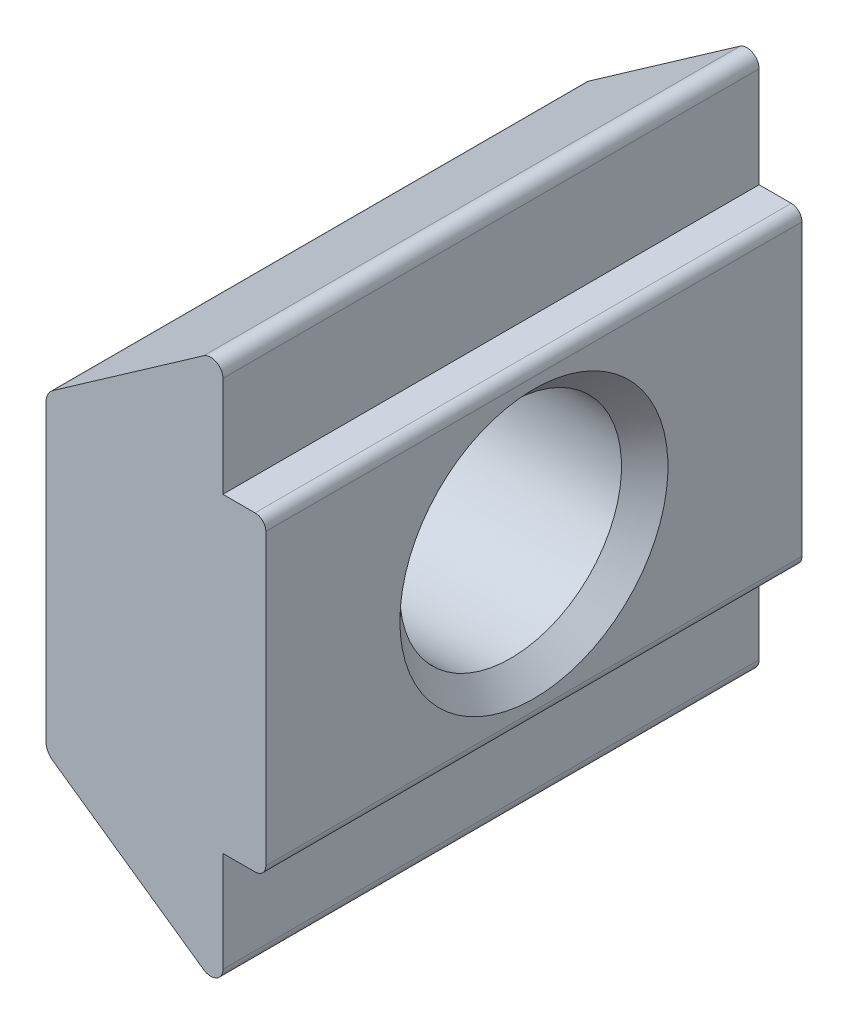
ISO-10303-21;
HEADER;
FILE_DESCRIPTION(('STEP AP214'),'2;1');
FILE_NAME('part.step','',(''),(''),'','','');
FILE_SCHEMA(('AUTOMOTIVE_DESIGN { 1 0 10303 214 1 1 1 1 }'));
ENDSEC;
DATA;
#1=APPLICATION_CONTEXT('core data for automotive mechanical design processes');
#2=APPLICATION_PROTOCOL_DEFINITION('international standard','automotive_design',2000,#1);
#3=PRODUCT_CONTEXT('',#1,'mechanical');
#4=PRODUCT('Part','Part','',(#3));
#5=PRODUCT_RELATED_PRODUCT_CATEGORY('part','',(#4));
#6=PRODUCT_DEFINITION_FORMATION('','',#4);
#7=PRODUCT_DEFINITION_CONTEXT('part definition',#1,'design');
#8=PRODUCT_DEFINITION('design','',#6,#7);
#9=PRODUCT_DEFINITION_SHAPE('','',#8);
#10=(LENGTH_UNIT() NAMED_UNIT(*) SI_UNIT(.MILLI.,.METRE.));
#11=(NAMED_UNIT(*) PLANE_ANGLE_UNIT() SI_UNIT($,.RADIAN.));
#12=(NAMED_UNIT(*) SI_UNIT($,.STERADIAN.) SOLID_ANGLE_UNIT());
#13=UNCERTAINTY_MEASURE_WITH_UNIT(LENGTH_MEASURE(1.E-05),#10,'distance_accuracy_value','');
#14=(GEOMETRIC_REPRESENTATION_CONTEXT(3) GLOBAL_UNCERTAINTY_ASSIGNED_CONTEXT((#13)) GLOBAL_UNIT_ASSIGNED_CONTEXT((#10,
#11,#12)) REPRESENTATION_CONTEXT('',''));
#15=CARTESIAN_POINT('',(0.,0.,0.));
#16=DIRECTION('',(0.,0.,1.));
#17=DIRECTION('',(1.,0.,0.));
#18=AXIS2_PLACEMENT_3D('',#15,#16,#17);
#19=CARTESIAN_POINT('',(-3.80000000000035,-2.74380333152817,5.));
#20=DIRECTION('',(0.,0.,-1.));
#21=DIRECTION('',(-1.,0.,0.));
#22=AXIS2_PLACEMENT_3D('',#19,#20,#21);
#23=CYLINDRICAL_SURFACE('',#22,0.299999999999655);
#24=DIRECTION('',(0.,0.,-1.));
#25=VECTOR('',#24,1.);
#26=CARTESIAN_POINT('',(-4.1,-2.743803331528,5.));
#27=LINE('',#26,#25);
#28=CARTESIAN_POINT('',(-4.1,-2.743803331528,5.));
#29=VERTEX_POINT('',#28);
#30=CARTESIAN_POINT('',(-4.1,-2.743803331528,-5.));
#31=VERTEX_POINT('',#30);
#32=EDGE_CURVE('E152',#29,#31,#27,.T.);
#33=ORIENTED_EDGE('',*,*,#32,.T.);
#34=CARTESIAN_POINT('',(-3.80000000000035,-2.74380333152817,-5.));
#35=DIRECTION('',(0.,0.,1.));
#36=DIRECTION('',(1.,0.,0.));
#37=AXIS2_PLACEMENT_3D('',#34,#35,#36);
#38=CIRCLE('',#37,0.299999999999655);
#39=CARTESIAN_POINT('',(-3.972038703309,-2.9895729076837,-5.));
#40=VERTEX_POINT('',#39);
#41=EDGE_CURVE('E146',#31,#40,#38,.T.);
#42=ORIENTED_EDGE('',*,*,#41,.T.);
#43=DIRECTION('',(0.,0.,-1.));
#44=VECTOR('',#43,1.);
#45=CARTESIAN_POINT('',(-3.972038703309,-2.9895729076837,5.));
#46=LINE('',#45,#44);
#47=CARTESIAN_POINT('',(-3.972038703309,-2.9895729076837,5.));
#48=VERTEX_POINT('',#47);
#49=EDGE_CURVE('E11',#48,#40,#46,.T.);
#50=ORIENTED_EDGE('',*,*,#49,.F.);
#51=CARTESIAN_POINT('',(-3.80000000000035,-2.74380333152817,5.));
#52=DIRECTION('',(0.,0.,1.));
#53=DIRECTION('',(1.,0.,0.));
#54=AXIS2_PLACEMENT_3D('',#51,#52,#53);
#55=CIRCLE('',#54,0.299999999999655);
#56=EDGE_CURVE('E193',#29,#48,#55,.T.);
#57=ORIENTED_EDGE('',*,*,#56,.F.);
#58=EDGE_LOOP('',(#33,#42,#50,#57));
#59=FACE_BOUND('',#58,.T.);
#60=ADVANCED_FACE('F34',(#59),#23,.T.);
#61=CARTESIAN_POINT('',(-3.972038703309,-2.9895729076837,5.));
#62=DIRECTION('',(0.573462344363338,0.819231920519034,0.));
#63=DIRECTION('',(-0.819231920519034,0.573462344363338,0.));
#64=AXIS2_PLACEMENT_3D('',#61,#62,#63);
#65=PLANE('',#64);
#66=ORIENTED_EDGE('',*,*,#49,.T.);
#67=DIRECTION('',(0.819231920519034,-0.573462344363338,0.));
#68=VECTOR('',#67,1.);
#69=CARTESIAN_POINT('',(-3.972038703309,-2.9895729076837,-5.));
#70=LINE('',#69,#68);
#71=CARTESIAN_POINT('',(-1.1589060402685,-4.9587657718121,-5.));
#72=VERTEX_POINT('',#71);
#73=EDGE_CURVE('E136',#40,#72,#70,.T.);
#74=ORIENTED_EDGE('',*,*,#73,.T.);
#75=DIRECTION('',(0.,0.,-1.));
#76=VECTOR('',#75,1.);
#77=CARTESIAN_POINT('',(-1.1589060402685,-4.9587657718121,5.));
#78=LINE('',#77,#76);
#79=CARTESIAN_POINT('',(-1.1589060402685,-4.9587657718121,5.));
#80=VERTEX_POINT('',#79);
#81=EDGE_CURVE('E41',#80,#72,#78,.T.);
#82=ORIENTED_EDGE('',*,*,#81,.F.);
#83=DIRECTION('',(0.819231920519034,-0.573462344363338,0.));
#84=VECTOR('',#83,1.);
#85=CARTESIAN_POINT('',(-3.972038703309,-2.9895729076837,5.));
#86=LINE('',#85,#84);
#87=EDGE_CURVE('E137',#48,#80,#86,.T.);
#88=ORIENTED_EDGE('',*,*,#87,.F.);
#89=EDGE_LOOP('',(#66,#74,#82,#88));
#90=FACE_BOUND('',#89,.T.);
#91=ADVANCED_FACE('F134',(#90),#65,.F.);
#92=CARTESIAN_POINT('',(-1.02809999999485,-4.77189846641082,5.));
#93=DIRECTION('',(0.,0.,-1.));
#94=DIRECTION('',(-1.,0.,0.));
#95=AXIS2_PLACEMENT_3D('',#92,#93,#94);
#96=CYLINDRICAL_SURFACE('',#95,0.228100000000009);
#97=ORIENTED_EDGE('',*,*,#81,.T.);
#98=CARTESIAN_POINT('',(-1.02809999999485,-4.77189846641082,-5.));
#99=DIRECTION('',(0.,0.,1.));
#100=DIRECTION('',(1.,0.,0.));
#101=AXIS2_PLACEMENT_3D('',#98,#99,#100);
#102=CIRCLE('',#101,0.228100000000009);
#103=CARTESIAN_POINT('',(-0.8,-4.7719,-5.));
#104=VERTEX_POINT('',#103);
#105=EDGE_CURVE('E150',#72,#104,#102,.T.);
#106=ORIENTED_EDGE('',*,*,#105,.T.);
#107=DIRECTION('',(0.,0.,-1.));
#108=VECTOR('',#107,1.);
#109=CARTESIAN_POINT('',(-0.8,-4.7719,5.));
#110=LINE('',#109,#108);
#111=CARTESIAN_POINT('',(-0.8,-4.7719,5.));
#112=VERTEX_POINT('',#111);
#113=EDGE_CURVE('E239',#112,#104,#110,.T.);
#114=ORIENTED_EDGE('',*,*,#113,.F.);
#115=CARTESIAN_POINT('',(-1.02809999999485,-4.77189846641082,5.));
#116=DIRECTION('',(0.,0.,1.));
#117=DIRECTION('',(1.,0.,0.));
#118=AXIS2_PLACEMENT_3D('',#115,#116,#117);
#119=CIRCLE('',#118,0.228100000000009);
#120=EDGE_CURVE('E196',#80,#112,#119,.T.);
#121=ORIENTED_EDGE('',*,*,#120,.F.);
#122=EDGE_LOOP('',(#97,#106,#114,#121));
#123=FACE_BOUND('',#122,.T.);
#124=ADVANCED_FACE('F242',(#123),#96,.T.);
#125=CARTESIAN_POINT('',(-0.8,-4.7719,5.));
#126=DIRECTION('',(-1.,0.,0.));
#127=DIRECTION('',(0.,0.,1.));
#128=AXIS2_PLACEMENT_3D('',#125,#126,#127);
#129=PLANE('',#128);
#130=ORIENTED_EDGE('',*,*,#113,.T.);
#131=DIRECTION('',(0.,1.,0.));
#132=VECTOR('',#131,1.);
#133=CARTESIAN_POINT('',(-0.8,-4.7719,-5.));
#134=LINE('',#133,#132);
#135=CARTESIAN_POINT('',(-0.8,-2.9,-5.));
#136=VERTEX_POINT('',#135);
#137=EDGE_CURVE('E161',#104,#136,#134,.T.);
#138=ORIENTED_EDGE('',*,*,#137,.T.);
#139=DIRECTION('',(0.,0.,-1.));
#140=VECTOR('',#139,1.);
#141=CARTESIAN_POINT('',(-0.8,-2.9,5.));
#142=LINE('',#141,#140);
#143=CARTESIAN_POINT('',(-0.8,-2.9,5.));
#144=VERTEX_POINT('',#143);
#145=EDGE_CURVE('E237',#144,#136,#142,.T.);
#146=ORIENTED_EDGE('',*,*,#145,.F.);
#147=DIRECTION('',(0.,1.,0.));
#148=VECTOR('',#147,1.);
#149=CARTESIAN_POINT('',(-0.8,-4.7719,5.));
#150=LINE('',#149,#148);
#151=EDGE_CURVE('E198',#112,#144,#150,.T.);
#152=ORIENTED_EDGE('',*,*,#151,.F.);
#153=EDGE_LOOP('',(#130,#138,#146,#152));
#154=FACE_BOUND('',#153,.T.);
#155=ADVANCED_FACE('F250',(#154),#129,.F.);
#156=CARTESIAN_POINT('',(-0.8,-2.9,5.));
#157=DIRECTION('',(0.,1.,0.));
#158=DIRECTION('',(0.,0.,1.));
#159=AXIS2_PLACEMENT_3D('',#156,#157,#158);
#160=PLANE('',#159);
#161=ORIENTED_EDGE('',*,*,#145,.T.);
#162=DIRECTION('',(1.,0.,0.));
#163=VECTOR('',#162,1.);
#164=CARTESIAN_POINT('',(-0.8,-2.9,-5.));
#165=LINE('',#164,#163);
#166=CARTESIAN_POINT('',(-0.2,-2.9,-5.));
#167=VERTEX_POINT('',#166);
#168=EDGE_CURVE('E164',#136,#167,#165,.T.);
#169=ORIENTED_EDGE('',*,*,#168,.T.);
#170=DIRECTION('',(0.,0.,-1.));
#171=VECTOR('',#170,1.);
#172=CARTESIAN_POINT('',(-0.2,-2.9,5.));
#173=LINE('',#172,#171);
#174=CARTESIAN_POINT('',(-0.2,-2.9,5.));
#175=VERTEX_POINT('',#174);
#176=EDGE_CURVE('E235',#175,#167,#173,.T.);
#177=ORIENTED_EDGE('',*,*,#176,.F.);
#178=DIRECTION('',(1.,0.,0.));
#179=VECTOR('',#178,1.);
#180=CARTESIAN_POINT('',(-0.8,-2.9,5.));
#181=LINE('',#180,#179);
#182=EDGE_CURVE('E200',#144,#175,#181,.T.);
#183=ORIENTED_EDGE('',*,*,#182,.F.);
#184=EDGE_LOOP('',(#161,#169,#177,#183));
#185=FACE_BOUND('',#184,.T.);
#186=ADVANCED_FACE('F253',(#185),#160,.F.);
#187=CARTESIAN_POINT('',(-0.200000000000016,-2.69999999999998,5.));
#188=DIRECTION('',(0.,0.,-1.));
#189=DIRECTION('',(-1.,0.,0.));
#190=AXIS2_PLACEMENT_3D('',#187,#188,#189);
#191=CYLINDRICAL_SURFACE('',#190,0.200000000000016);
#192=ORIENTED_EDGE('',*,*,#176,.T.);
#193=CARTESIAN_POINT('',(-0.200000000000016,-2.69999999999998,-5.));
#194=DIRECTION('',(0.,0.,1.));
#195=DIRECTION('',(1.,0.,0.));
#196=AXIS2_PLACEMENT_3D('',#193,#194,#195);
#197=CIRCLE('',#196,0.200000000000016);
#198=CARTESIAN_POINT('',(0.,-2.7,-5.));
#199=VERTEX_POINT('',#198);
#200=EDGE_CURVE('E167',#167,#199,#197,.T.);
#201=ORIENTED_EDGE('',*,*,#200,.T.);
#202=DIRECTION('',(0.,0.,-1.));
#203=VECTOR('',#202,1.);
#204=CARTESIAN_POINT('',(0.,-2.7,5.));
#205=LINE('',#204,#203);
#206=CARTESIAN_POINT('',(0.,-2.7,5.));
#207=VERTEX_POINT('',#206);
#208=EDGE_CURVE('E233',#207,#199,#205,.T.);
#209=ORIENTED_EDGE('',*,*,#208,.F.);
#210=CARTESIAN_POINT('',(-0.200000000000016,-2.69999999999998,5.));
#211=DIRECTION('',(0.,0.,1.));
#212=DIRECTION('',(1.,0.,0.));
#213=AXIS2_PLACEMENT_3D('',#210,#211,#212);
#214=CIRCLE('',#213,0.200000000000016);
#215=EDGE_CURVE('E202',#175,#207,#214,.T.);
#216=ORIENTED_EDGE('',*,*,#215,.F.);
#217=EDGE_LOOP('',(#192,#201,#209,#216));
#218=FACE_BOUND('',#217,.T.);
#219=ADVANCED_FACE('F258',(#218),#191,.T.);
#220=CARTESIAN_POINT('',(0.,-2.7,5.));
#221=DIRECTION('',(-1.,0.,0.));
#222=DIRECTION('',(0.,0.,1.));
#223=AXIS2_PLACEMENT_3D('',#220,#221,#222);
#224=PLANE('',#223);
#225=CARTESIAN_POINT('',(0.,0.,0.));
#226=DIRECTION('',(-1.,0.,0.));
#227=DIRECTION('',(0.,0.,1.));
#228=AXIS2_PLACEMENT_3D('',#225,#226,#227);
#229=CIRCLE('',#228,2.5);
#230=CARTESIAN_POINT('',(0.,0.,2.5));
#231=VERTEX_POINT('',#230);
#232=EDGE_CURVE('E407',#231,#231,#229,.T.);
#233=ORIENTED_EDGE('',*,*,#232,.T.);
#234=EDGE_LOOP('',(#233));
#235=FACE_BOUND('',#234,.T.);
#236=ORIENTED_EDGE('',*,*,#208,.T.);
#237=DIRECTION('',(0.,1.,0.));
#238=VECTOR('',#237,1.);
#239=CARTESIAN_POINT('',(0.,-2.7,-5.));
#240=LINE('',#239,#238);
#241=CARTESIAN_POINT('',(0.,2.7,-5.));
#242=VERTEX_POINT('',#241);
#243=EDGE_CURVE('E170',#199,#242,#240,.T.);
#244=ORIENTED_EDGE('',*,*,#243,.T.);
#245=DIRECTION('',(0.,0.,-1.));
#246=VECTOR('',#245,1.);
#247=CARTESIAN_POINT('',(0.,2.7,5.));
#248=LINE('',#247,#246);
#249=CARTESIAN_POINT('',(0.,2.7,5.));
#250=VERTEX_POINT('',#249);
#251=EDGE_CURVE('E231',#250,#242,#248,.T.);
#252=ORIENTED_EDGE('',*,*,#251,.F.);
#253=DIRECTION('',(0.,1.,0.));
#254=VECTOR('',#253,1.);
#255=CARTESIAN_POINT('',(0.,-2.7,5.));
#256=LINE('',#255,#254);
#257=EDGE_CURVE('E204',#207,#250,#256,.T.);
#258=ORIENTED_EDGE('',*,*,#257,.F.);
#259=EDGE_LOOP('',(#236,#244,#252,#258));
#260=FACE_BOUND('',#259,.T.);
#261=ADVANCED_FACE('F264',(#235,#260),#224,.F.);
#262=CARTESIAN_POINT('',(-0.200000000000016,2.69999999999998,5.));
#263=DIRECTION('',(0.,0.,-1.));
#264=DIRECTION('',(-1.,0.,0.));
#265=AXIS2_PLACEMENT_3D('',#262,#263,#264);
#266=CYLINDRICAL_SURFACE('',#265,0.200000000000016);
#267=ORIENTED_EDGE('',*,*,#251,.T.);
#268=CARTESIAN_POINT('',(-0.200000000000016,2.69999999999998,-5.));
#269=DIRECTION('',(0.,0.,1.));
#270=DIRECTION('',(1.,0.,0.));
#271=AXIS2_PLACEMENT_3D('',#268,#269,#270);
#272=CIRCLE('',#271,0.200000000000016);
#273=CARTESIAN_POINT('',(-0.2,2.9,-5.));
#274=VERTEX_POINT('',#273);
#275=EDGE_CURVE('E173',#242,#274,#272,.T.);
#276=ORIENTED_EDGE('',*,*,#275,.T.);
#277=DIRECTION('',(0.,0.,-1.));
#278=VECTOR('',#277,1.);
#279=CARTESIAN_POINT('',(-0.2,2.9,5.));
#280=LINE('',#279,#278);
#281=CARTESIAN_POINT('',(-0.2,2.9,5.));
#282=VERTEX_POINT('',#281);
#283=EDGE_CURVE('E229',#282,#274,#280,.T.);
#284=ORIENTED_EDGE('',*,*,#283,.F.);
#285=CARTESIAN_POINT('',(-0.200000000000016,2.69999999999998,5.));
#286=DIRECTION('',(0.,0.,1.));
#287=DIRECTION('',(1.,0.,0.));
#288=AXIS2_PLACEMENT_3D('',#285,#286,#287);
#289=CIRCLE('',#288,0.200000000000016);
#290=EDGE_CURVE('E206',#250,#282,#289,.T.);
#291=ORIENTED_EDGE('',*,*,#290,.F.);
#292=EDGE_LOOP('',(#267,#276,#284,#291));
#293=FACE_BOUND('',#292,.T.);
#294=ADVANCED_FACE('F268',(#293),#266,.T.);
#295=CARTESIAN_POINT('',(-0.2,2.9,5.));
#296=DIRECTION('',(0.,-1.,0.));
#297=DIRECTION('',(0.,0.,-1.));
#298=AXIS2_PLACEMENT_3D('',#295,#296,#297);
#299=PLANE('',#298);
#300=ORIENTED_EDGE('',*,*,#283,.T.);
#301=DIRECTION('',(-1.,0.,0.));
#302=VECTOR('',#301,1.);
#303=CARTESIAN_POINT('',(-0.2,2.9,-5.));
#304=LINE('',#303,#302);
#305=CARTESIAN_POINT('',(-0.8,2.9,-5.));
#306=VERTEX_POINT('',#305);
#307=EDGE_CURVE('E176',#274,#306,#304,.T.);
#308=ORIENTED_EDGE('',*,*,#307,.T.);
#309=DIRECTION('',(0.,0.,-1.));
#310=VECTOR('',#309,1.);
#311=CARTESIAN_POINT('',(-0.8,2.9,5.));
#312=LINE('',#311,#310);
#313=CARTESIAN_POINT('',(-0.8,2.9,5.));
#314=VERTEX_POINT('',#313);
#315=EDGE_CURVE('E227',#314,#306,#312,.T.);
#316=ORIENTED_EDGE('',*,*,#315,.F.);
#317=DIRECTION('',(-1.,0.,0.));
#318=VECTOR('',#317,1.);
#319=CARTESIAN_POINT('',(-0.2,2.9,5.));
#320=LINE('',#319,#318);
#321=EDGE_CURVE('E208',#282,#314,#320,.T.);
#322=ORIENTED_EDGE('',*,*,#321,.F.);
#323=EDGE_LOOP('',(#300,#308,#316,#322));
#324=FACE_BOUND('',#323,.T.);
#325=ADVANCED_FACE('F273',(#324),#299,.F.);
#326=CARTESIAN_POINT('',(-0.8,2.9,5.));
#327=DIRECTION('',(-1.,0.,0.));
#328=DIRECTION('',(0.,0.,1.));
#329=AXIS2_PLACEMENT_3D('',#326,#327,#328);
#330=PLANE('',#329);
#331=ORIENTED_EDGE('',*,*,#315,.T.);
#332=DIRECTION('',(0.,1.,0.));
#333=VECTOR('',#332,1.);
#334=CARTESIAN_POINT('',(-0.8,2.9,-5.));
#335=LINE('',#334,#333);
#336=CARTESIAN_POINT('',(-0.8,4.7719,-5.));
#337=VERTEX_POINT('',#336);
#338=EDGE_CURVE('E179',#306,#337,#335,.T.);
#339=ORIENTED_EDGE('',*,*,#338,.T.);
#340=DIRECTION('',(0.,0.,-1.));
#341=VECTOR('',#340,1.);
#342=CARTESIAN_POINT('',(-0.8,4.7719,5.));
#343=LINE('',#342,#341);
#344=CARTESIAN_POINT('',(-0.8,4.7719,5.));
#345=VERTEX_POINT('',#344);
#346=EDGE_CURVE('E225',#345,#337,#343,.T.);
#347=ORIENTED_EDGE('',*,*,#346,.F.);
#348=DIRECTION('',(0.,1.,0.));
#349=VECTOR('',#348,1.);
#350=CARTESIAN_POINT('',(-0.8,2.9,5.));
#351=LINE('',#350,#349);
#352=EDGE_CURVE('E210',#314,#345,#351,.T.);
#353=ORIENTED_EDGE('',*,*,#352,.F.);
#354=EDGE_LOOP('',(#331,#339,#347,#353));
#355=FACE_BOUND('',#354,.T.);
#356=ADVANCED_FACE('F279',(#355),#330,.F.);
#357=CARTESIAN_POINT('',(-1.02809999999485,4.77189846641082,5.));
#358=DIRECTION('',(0.,0.,-1.));
#359=DIRECTION('',(-1.,0.,0.));
#360=AXIS2_PLACEMENT_3D('',#357,#358,#359);
#361=CYLINDRICAL_SURFACE('',#360,0.228100000000009);
#362=ORIENTED_EDGE('',*,*,#346,.T.);
#363=CARTESIAN_POINT('',(-1.02809999999485,4.77189846641082,-5.));
#364=DIRECTION('',(0.,0.,1.));
#365=DIRECTION('',(1.,0.,0.));
#366=AXIS2_PLACEMENT_3D('',#363,#364,#365);
#367=CIRCLE('',#366,0.228100000000009);
#368=CARTESIAN_POINT('',(-1.1589060402685,4.9587657718121,-5.));
#369=VERTEX_POINT('',#368);
#370=EDGE_CURVE('E182',#337,#369,#367,.T.);
#371=ORIENTED_EDGE('',*,*,#370,.T.);
#372=DIRECTION('',(0.,0.,-1.));
#373=VECTOR('',#372,1.);
#374=CARTESIAN_POINT('',(-1.1589060402685,4.9587657718121,5.));
#375=LINE('',#374,#373);
#376=CARTESIAN_POINT('',(-1.1589060402685,4.9587657718121,5.));
#377=VERTEX_POINT('',#376);
#378=EDGE_CURVE('E223',#377,#369,#375,.T.);
#379=ORIENTED_EDGE('',*,*,#378,.F.);
#380=CARTESIAN_POINT('',(-1.02809999999485,4.77189846641082,5.));
#381=DIRECTION('',(0.,0.,1.));
#382=DIRECTION('',(1.,0.,0.));
#383=AXIS2_PLACEMENT_3D('',#380,#381,#382);
#384=CIRCLE('',#383,0.228100000000009);
#385=EDGE_CURVE('E212',#345,#377,#384,.T.);
#386=ORIENTED_EDGE('',*,*,#385,.F.);
#387=EDGE_LOOP('',(#362,#371,#379,#386));
#388=FACE_BOUND('',#387,.T.);
#389=ADVANCED_FACE('F283',(#388),#361,.T.);
#390=CARTESIAN_POINT('',(-1.1589060402685,4.9587657718121,5.));
#391=DIRECTION('',(0.573462344363338,-0.819231920519034,0.));
#392=DIRECTION('',(0.819231920519034,0.573462344363338,0.));
#393=AXIS2_PLACEMENT_3D('',#390,#391,#392);
#394=PLANE('',#393);
#395=ORIENTED_EDGE('',*,*,#378,.T.);
#396=DIRECTION('',(-0.819231920519034,-0.573462344363338,0.));
#397=VECTOR('',#396,1.);
#398=CARTESIAN_POINT('',(-1.1589060402685,4.9587657718121,-5.));
#399=LINE('',#398,#397);
#400=CARTESIAN_POINT('',(-3.972038703309,2.9895729076837,-5.));
#401=VERTEX_POINT('',#400);
#402=EDGE_CURVE('E185',#369,#401,#399,.T.);
#403=ORIENTED_EDGE('',*,*,#402,.T.);
#404=DIRECTION('',(0.,0.,-1.));
#405=VECTOR('',#404,1.);
#406=CARTESIAN_POINT('',(-3.972038703309,2.9895729076837,5.));
#407=LINE('',#406,#405);
#408=CARTESIAN_POINT('',(-3.972038703309,2.9895729076837,5.));
#409=VERTEX_POINT('',#408);
#410=EDGE_CURVE('E221',#409,#401,#407,.T.);
#411=ORIENTED_EDGE('',*,*,#410,.F.);
#412=DIRECTION('',(-0.819231920519034,-0.573462344363338,0.));
#413=VECTOR('',#412,1.);
#414=CARTESIAN_POINT('',(-1.1589060402685,4.9587657718121,5.));
#415=LINE('',#414,#413);
#416=EDGE_CURVE('E214',#377,#409,#415,.T.);
#417=ORIENTED_EDGE('',*,*,#416,.F.);
#418=EDGE_LOOP('',(#395,#403,#411,#417));
#419=FACE_BOUND('',#418,.T.);
#420=ADVANCED_FACE('F288',(#419),#394,.F.);
#421=CARTESIAN_POINT('',(-3.80000000000035,2.74380333152817,5.));
#422=DIRECTION('',(0.,0.,-1.));
#423=DIRECTION('',(-1.,0.,0.));
#424=AXIS2_PLACEMENT_3D('',#421,#422,#423);
#425=CYLINDRICAL_SURFACE('',#424,0.299999999999655);
#426=ORIENTED_EDGE('',*,*,#410,.T.);
#427=CARTESIAN_POINT('',(-3.80000000000035,2.74380333152817,-5.));
#428=DIRECTION('',(0.,0.,1.));
#429=DIRECTION('',(1.,0.,0.));
#430=AXIS2_PLACEMENT_3D('',#427,#428,#429);
#431=CIRCLE('',#430,0.299999999999655);
#432=CARTESIAN_POINT('',(-4.1,2.743803331528,-5.));
#433=VERTEX_POINT('',#432);
#434=EDGE_CURVE('E188',#401,#433,#431,.T.);
#435=ORIENTED_EDGE('',*,*,#434,.T.);
#436=DIRECTION('',(0.,0.,-1.));
#437=VECTOR('',#436,1.);
#438=CARTESIAN_POINT('',(-4.1,2.743803331528,5.));
#439=LINE('',#438,#437);
#440=CARTESIAN_POINT('',(-4.1,2.743803331528,5.));
#441=VERTEX_POINT('',#440);
#442=EDGE_CURVE('E219',#441,#433,#439,.T.);
#443=ORIENTED_EDGE('',*,*,#442,.F.);
#444=CARTESIAN_POINT('',(-3.80000000000035,2.74380333152817,5.));
#445=DIRECTION('',(0.,0.,1.));
#446=DIRECTION('',(1.,0.,0.));
#447=AXIS2_PLACEMENT_3D('',#444,#445,#446);
#448=CIRCLE('',#447,0.299999999999655);
#449=EDGE_CURVE('E53',#409,#441,#448,.T.);
#450=ORIENTED_EDGE('',*,*,#449,.F.);
#451=EDGE_LOOP('',(#426,#435,#443,#450));
#452=FACE_BOUND('',#451,.T.);
#453=ADVANCED_FACE('F291',(#452),#425,.T.);
#454=CARTESIAN_POINT('',(-4.1,2.743803331528,5.));
#455=DIRECTION('',(1.,0.,0.));
#456=DIRECTION('',(0.,0.,-1.));
#457=AXIS2_PLACEMENT_3D('',#454,#455,#456);
#458=PLANE('',#457);
#459=CARTESIAN_POINT('',(-4.1,0.,0.));
#460=DIRECTION('',(-1.,0.,0.));
#461=DIRECTION('',(0.,0.,1.));
#462=AXIS2_PLACEMENT_3D('',#459,#460,#461);
#463=CIRCLE('',#462,2.5);
#464=CARTESIAN_POINT('',(-4.1,0.,2.5));
#465=VERTEX_POINT('',#464);
#466=EDGE_CURVE('E153',#465,#465,#463,.T.);
#467=ORIENTED_EDGE('',*,*,#466,.F.);
#468=EDGE_LOOP('',(#467));
#469=FACE_BOUND('',#468,.T.);
#470=ORIENTED_EDGE('',*,*,#442,.T.);
#471=DIRECTION('',(0.,-1.,0.));
#472=VECTOR('',#471,1.);
#473=CARTESIAN_POINT('',(-4.1,2.743803331528,-5.));
#474=LINE('',#473,#472);
#475=EDGE_CURVE('E191',#433,#31,#474,.T.);
#476=ORIENTED_EDGE('',*,*,#475,.T.);
#477=ORIENTED_EDGE('',*,*,#32,.F.);
#478=DIRECTION('',(0.,-1.,0.));
#479=VECTOR('',#478,1.);
#480=CARTESIAN_POINT('',(-4.1,2.743803331528,5.));
#481=LINE('',#480,#479);
#482=EDGE_CURVE('E48',#441,#29,#481,.T.);
#483=ORIENTED_EDGE('',*,*,#482,.F.);
#484=EDGE_LOOP('',(#470,#476,#477,#483));
#485=FACE_BOUND('',#484,.T.);
#486=ADVANCED_FACE('F293',(#469,#485),#458,.F.);
#487=CARTESIAN_POINT('',(-3.80000000000035,-2.74380333152817,5.));
#488=DIRECTION('',(0.,0.,1.));
#489=DIRECTION('',(1.,0.,0.));
#490=AXIS2_PLACEMENT_3D('',#487,#488,#489);
#491=PLANE('',#490);
#492=ORIENTED_EDGE('',*,*,#56,.T.);
#493=ORIENTED_EDGE('',*,*,#87,.T.);
#494=ORIENTED_EDGE('',*,*,#120,.T.);
#495=ORIENTED_EDGE('',*,*,#151,.T.);
#496=ORIENTED_EDGE('',*,*,#182,.T.);
#497=ORIENTED_EDGE('',*,*,#215,.T.);
#498=ORIENTED_EDGE('',*,*,#257,.T.);
#499=ORIENTED_EDGE('',*,*,#290,.T.);
#500=ORIENTED_EDGE('',*,*,#321,.T.);
#501=ORIENTED_EDGE('',*,*,#352,.T.);
#502=ORIENTED_EDGE('',*,*,#385,.T.);
#503=ORIENTED_EDGE('',*,*,#416,.T.);
#504=ORIENTED_EDGE('',*,*,#449,.T.);
#505=ORIENTED_EDGE('',*,*,#482,.T.);
#506=EDGE_LOOP('',(#492,#493,#494,#495,#496,#497,#498,#499,#500,#501,#502,#503,#504,#505));
#507=FACE_BOUND('',#506,.T.);
#508=ADVANCED_FACE('F245',(#507),#491,.T.);
#509=CARTESIAN_POINT('',(-3.80000000000035,-2.74380333152817,-5.));
#510=DIRECTION('',(0.,0.,1.));
#511=DIRECTION('',(1.,0.,0.));
#512=AXIS2_PLACEMENT_3D('',#509,#510,#511);
#513=PLANE('',#512);
#514=ORIENTED_EDGE('',*,*,#41,.F.);
#515=ORIENTED_EDGE('',*,*,#475,.F.);
#516=ORIENTED_EDGE('',*,*,#434,.F.);
#517=ORIENTED_EDGE('',*,*,#402,.F.);
#518=ORIENTED_EDGE('',*,*,#370,.F.);
#519=ORIENTED_EDGE('',*,*,#338,.F.);
#520=ORIENTED_EDGE('',*,*,#307,.F.);
#521=ORIENTED_EDGE('',*,*,#275,.F.);
#522=ORIENTED_EDGE('',*,*,#243,.F.);
#523=ORIENTED_EDGE('',*,*,#200,.F.);
#524=ORIENTED_EDGE('',*,*,#168,.F.);
#525=ORIENTED_EDGE('',*,*,#137,.F.);
#526=ORIENTED_EDGE('',*,*,#105,.F.);
#527=ORIENTED_EDGE('',*,*,#73,.F.);
#528=EDGE_LOOP('',(#514,#515,#516,#517,#518,#519,#520,#521,#522,#523,#524,#525,#526,#527));
#529=FACE_BOUND('',#528,.T.);
#530=ADVANCED_FACE('F144',(#529),#513,.F.);
#531=CARTESIAN_POINT('',(-3.667,0.,0.));
#532=DIRECTION('',(-1.,0.,0.));
#533=DIRECTION('',(0.,0.,1.));
#534=AXIS2_PLACEMENT_3D('',#531,#532,#533);
#535=CONICAL_SURFACE('',#534,2.067,0.785398163397448);
#536=ORIENTED_EDGE('',*,*,#466,.T.);
#537=EDGE_LOOP('',(#536));
#538=FACE_BOUND('',#537,.T.);
#539=CARTESIAN_POINT('',(-3.667,0.,0.));
#540=DIRECTION('',(-1.,0.,0.));
#541=DIRECTION('',(0.,0.,1.));
#542=AXIS2_PLACEMENT_3D('',#539,#540,#541);
#543=CIRCLE('',#542,2.067);
#544=CARTESIAN_POINT('',(-3.667,0.,2.067));
#545=VERTEX_POINT('',#544);
#546=EDGE_CURVE('E156',#545,#545,#543,.T.);
#547=ORIENTED_EDGE('',*,*,#546,.F.);
#548=EDGE_LOOP('',(#547));
#549=FACE_BOUND('',#548,.T.);
#550=ADVANCED_FACE('F357',(#538,#549),#535,.F.);
#551=CARTESIAN_POINT('',(0.,0.,0.));
#552=DIRECTION('',(-1.,0.,0.));
#553=DIRECTION('',(0.,0.,1.));
#554=AXIS2_PLACEMENT_3D('',#551,#552,#553);
#555=CYLINDRICAL_SURFACE('',#554,2.067);
#556=ORIENTED_EDGE('',*,*,#546,.T.);
#557=EDGE_LOOP('',(#556));
#558=FACE_BOUND('',#557,.T.);
#559=CARTESIAN_POINT('',(-0.433,0.,0.));
#560=DIRECTION('',(-1.,0.,0.));
#561=DIRECTION('',(0.,0.,1.));
#562=AXIS2_PLACEMENT_3D('',#559,#560,#561);
#563=CIRCLE('',#562,2.067);
#564=CARTESIAN_POINT('',(-0.433,0.,2.067));
#565=VERTEX_POINT('',#564);
#566=EDGE_CURVE('E404',#565,#565,#563,.T.);
#567=ORIENTED_EDGE('',*,*,#566,.F.);
#568=EDGE_LOOP('',(#567));
#569=FACE_BOUND('',#568,.T.);
#570=ADVANCED_FACE('F377',(#558,#569),#555,.F.);
#571=CARTESIAN_POINT('',(0.,0.,0.));
#572=DIRECTION('',(1.,0.,0.));
#573=DIRECTION('',(0.,0.,-1.));
#574=AXIS2_PLACEMENT_3D('',#571,#572,#573);
#575=CONICAL_SURFACE('',#574,2.5,0.785398163397449);
#576=ORIENTED_EDGE('',*,*,#566,.T.);
#577=EDGE_LOOP('',(#576));
#578=FACE_BOUND('',#577,.T.);
#579=ORIENTED_EDGE('',*,*,#232,.F.);
#580=EDGE_LOOP('',(#579));
#581=FACE_BOUND('',#580,.T.);
#582=ADVANCED_FACE('F387',(#578,#581),#575,.F.);
#583=CLOSED_SHELL('',(#60,#91,#124,#155,#186,#219,#261,#294,#325,#356,#389,#420,#453,#486,#508,
#530,#550,#570,#582));
#584=MANIFOLD_SOLID_BREP('B2',#583);
#585=ADVANCED_BREP_SHAPE_REPRESENTATION('',(#18,#584),#14);
#586=SHAPE_DEFINITION_REPRESENTATION(#9,#585);
ENDSEC;
END-ISO-10303-21;
